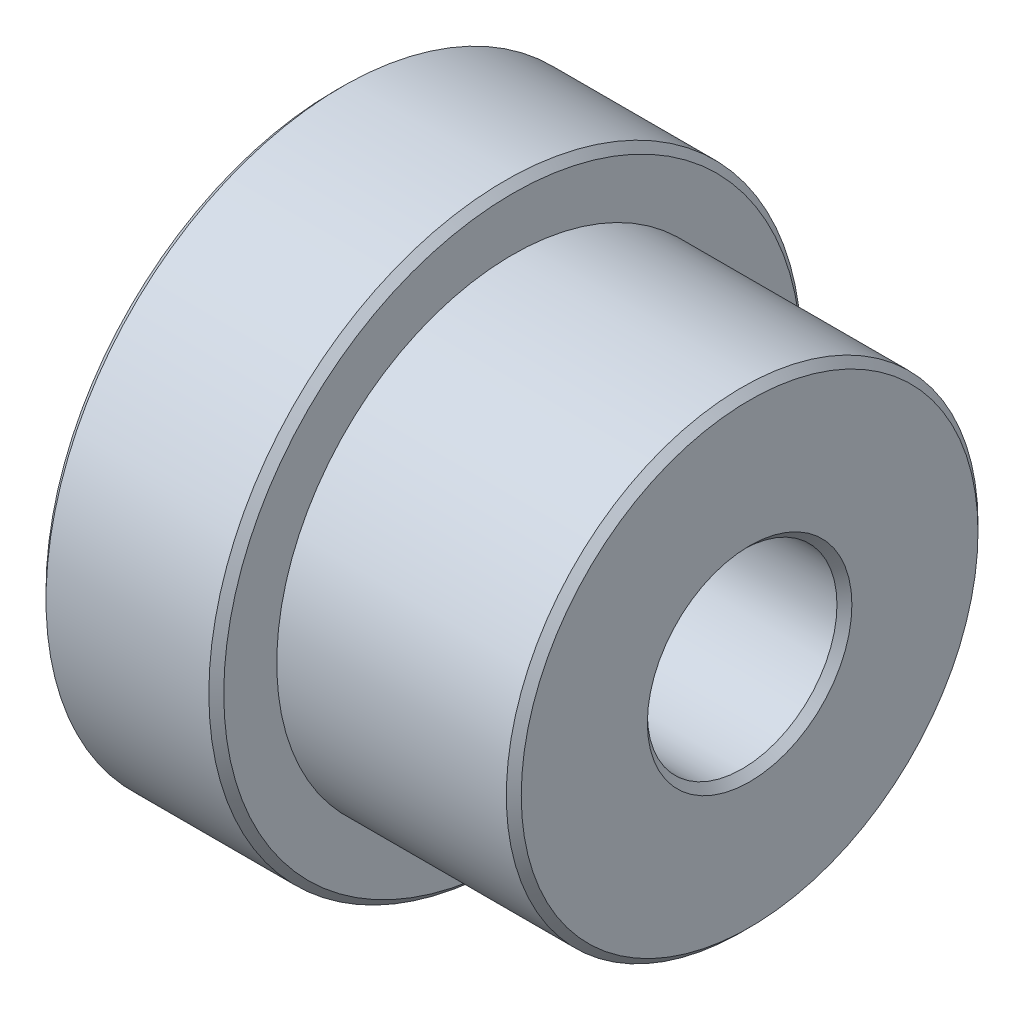
ISO-10303-21;
HEADER;
FILE_DESCRIPTION(('STEP AP214'),'2;1');
FILE_NAME('part.step','',(''),(''),'','','');
FILE_SCHEMA(('AUTOMOTIVE_DESIGN { 1 0 10303 214 1 1 1 1 }'));
ENDSEC;
DATA;
#1=APPLICATION_CONTEXT('core data for automotive mechanical design processes');
#2=APPLICATION_PROTOCOL_DEFINITION('international standard','automotive_design',2000,#1);
#3=PRODUCT_CONTEXT('',#1,'mechanical');
#4=PRODUCT('Part','Part','',(#3));
#5=PRODUCT_RELATED_PRODUCT_CATEGORY('part','',(#4));
#6=PRODUCT_DEFINITION_FORMATION('','',#4);
#7=PRODUCT_DEFINITION_CONTEXT('part definition',#1,'design');
#8=PRODUCT_DEFINITION('design','',#6,#7);
#9=PRODUCT_DEFINITION_SHAPE('','',#8);
#10=(LENGTH_UNIT() NAMED_UNIT(*) SI_UNIT(.MILLI.,.METRE.));
#11=(NAMED_UNIT(*) PLANE_ANGLE_UNIT() SI_UNIT($,.RADIAN.));
#12=(NAMED_UNIT(*) SI_UNIT($,.STERADIAN.) SOLID_ANGLE_UNIT());
#13=UNCERTAINTY_MEASURE_WITH_UNIT(LENGTH_MEASURE(1.E-05),#10,'distance_accuracy_value','');
#14=(GEOMETRIC_REPRESENTATION_CONTEXT(3) GLOBAL_UNCERTAINTY_ASSIGNED_CONTEXT((#13)) GLOBAL_UNIT_ASSIGNED_CONTEXT((#10,
#11,#12)) REPRESENTATION_CONTEXT('',''));
#15=CARTESIAN_POINT('',(0.,0.,0.));
#16=DIRECTION('',(0.,0.,1.));
#17=DIRECTION('',(1.,0.,0.));
#18=AXIS2_PLACEMENT_3D('',#15,#16,#17);
#19=CARTESIAN_POINT('',(12.7,0.,0.));
#20=DIRECTION('',(-1.,0.,0.));
#21=DIRECTION('',(0.,0.,1.));
#22=AXIS2_PLACEMENT_3D('',#19,#20,#21);
#23=CYLINDRICAL_SURFACE('',#22,12.6365);
#24=CARTESIAN_POINT('',(12.3,0.,0.));
#25=DIRECTION('',(1.,0.,0.));
#26=DIRECTION('',(0.,0.,-1.));
#27=AXIS2_PLACEMENT_3D('',#24,#25,#26);
#28=CIRCLE('',#27,12.6365);
#29=CARTESIAN_POINT('',(12.3,0.,-12.6365));
#30=VERTEX_POINT('',#29);
#31=EDGE_CURVE('E46',#30,#30,#28,.F.);
#32=ORIENTED_EDGE('',*,*,#31,.T.);
#33=EDGE_LOOP('',(#32));
#34=FACE_BOUND('',#33,.T.);
#35=CARTESIAN_POINT('',(0.,0.,0.));
#36=DIRECTION('',(1.,0.,0.));
#37=DIRECTION('',(0.,0.,-1.));
#38=AXIS2_PLACEMENT_3D('',#35,#36,#37);
#39=CIRCLE('',#38,12.6365);
#40=CARTESIAN_POINT('',(0.,0.,-12.6365));
#41=VERTEX_POINT('',#40);
#42=EDGE_CURVE('E77',#41,#41,#39,.T.);
#43=ORIENTED_EDGE('',*,*,#42,.T.);
#44=EDGE_LOOP('',(#43));
#45=FACE_BOUND('',#44,.T.);
#46=ADVANCED_FACE('F38',(#34,#45),#23,.T.);
#47=CARTESIAN_POINT('',(12.7,0.,0.));
#48=DIRECTION('',(1.,0.,0.));
#49=DIRECTION('',(0.,0.,-1.));
#50=AXIS2_PLACEMENT_3D('',#47,#48,#49);
#51=PLANE('',#50);
#52=CARTESIAN_POINT('',(12.7,0.,0.));
#53=DIRECTION('',(1.,0.,0.));
#54=DIRECTION('',(0.,0.,-1.));
#55=AXIS2_PLACEMENT_3D('',#52,#53,#54);
#56=CIRCLE('',#55,12.2365);
#57=CARTESIAN_POINT('',(12.7,0.,-12.2365));
#58=VERTEX_POINT('',#57);
#59=EDGE_CURVE('E50',#58,#58,#56,.T.);
#60=ORIENTED_EDGE('',*,*,#59,.T.);
#61=EDGE_LOOP('',(#60));
#62=FACE_BOUND('',#61,.T.);
#63=CARTESIAN_POINT('',(12.7,0.,0.));
#64=DIRECTION('',(1.,0.,0.));
#65=DIRECTION('',(0.,0.,-1.));
#66=AXIS2_PLACEMENT_3D('',#63,#64,#65);
#67=CIRCLE('',#66,5.48000000000001);
#68=CARTESIAN_POINT('',(12.7,0.,-5.48000000000001));
#69=VERTEX_POINT('',#68);
#70=EDGE_CURVE('E54',#69,#69,#67,.F.);
#71=ORIENTED_EDGE('',*,*,#70,.T.);
#72=EDGE_LOOP('',(#71));
#73=FACE_BOUND('',#72,.T.);
#74=ADVANCED_FACE('F126',(#62,#73),#51,.T.);
#75=CARTESIAN_POINT('',(-9.525,0.,0.));
#76=DIRECTION('',(1.,0.,0.));
#77=DIRECTION('',(0.,0.,-1.));
#78=AXIS2_PLACEMENT_3D('',#75,#76,#77);
#79=CYLINDRICAL_SURFACE('',#78,15.875);
#80=CARTESIAN_POINT('',(-0.400000000000005,0.,0.));
#81=DIRECTION('',(-1.,0.,0.));
#82=DIRECTION('',(0.,0.,1.));
#83=AXIS2_PLACEMENT_3D('',#80,#81,#82);
#84=CIRCLE('',#83,15.875);
#85=CARTESIAN_POINT('',(-0.400000000000005,0.,-15.875));
#86=VERTEX_POINT('',#85);
#87=EDGE_CURVE('E62',#86,#86,#84,.T.);
#88=CARTESIAN_POINT('',(-9.12500000000002,0.,0.));
#89=DIRECTION('',(-1.,0.,0.));
#90=DIRECTION('',(0.,0.,1.));
#91=AXIS2_PLACEMENT_3D('',#88,#89,#90);
#92=CIRCLE('',#91,15.875);
#93=CARTESIAN_POINT('',(-9.12500000000002,0.,-15.875));
#94=VERTEX_POINT('',#93);
#95=EDGE_CURVE('E65',#94,#94,#92,.F.);
#96=CARTESIAN_POINT('',(-0.400000000000005,0.,-15.875));
#97=CARTESIAN_POINT('',(-0.490885416666671,0.,-15.875));
#98=CARTESIAN_POINT('',(-0.581770833333339,0.,-15.875));
#99=CARTESIAN_POINT('',(-0.763541666666672,0.,-15.875));
#100=CARTESIAN_POINT('',(-0.854427083333339,0.,-15.875));
#101=CARTESIAN_POINT('',(-1.03619791666667,0.,-15.875));
#102=CARTESIAN_POINT('',(-1.12708333333334,0.,-15.875));
#103=CARTESIAN_POINT('',(-1.30885416666667,0.,-15.875));
#104=CARTESIAN_POINT('',(-1.39973958333334,0.,-15.875));
#105=CARTESIAN_POINT('',(-1.58151041666667,0.,-15.875));
#106=CARTESIAN_POINT('',(-1.67239583333334,0.,-15.875));
#107=CARTESIAN_POINT('',(-1.85416666666667,0.,-15.875));
#108=CARTESIAN_POINT('',(-1.94505208333334,0.,-15.875));
#109=CARTESIAN_POINT('',(-2.12682291666667,0.,-15.875));
#110=CARTESIAN_POINT('',(-2.21770833333334,0.,-15.875));
#111=CARTESIAN_POINT('',(-2.39947916666667,0.,-15.875));
#112=CARTESIAN_POINT('',(-2.49036458333334,0.,-15.875));
#113=CARTESIAN_POINT('',(-2.67213541666667,0.,-15.875));
#114=CARTESIAN_POINT('',(-2.76302083333334,0.,-15.875));
#115=CARTESIAN_POINT('',(-2.94479166666668,0.,-15.875));
#116=CARTESIAN_POINT('',(-3.03567708333334,0.,-15.875));
#117=CARTESIAN_POINT('',(-3.21744791666668,0.,-15.875));
#118=CARTESIAN_POINT('',(-3.30833333333334,0.,-15.875));
#119=CARTESIAN_POINT('',(-3.49010416666668,0.,-15.875));
#120=CARTESIAN_POINT('',(-3.58098958333334,0.,-15.875));
#121=CARTESIAN_POINT('',(-3.76276041666668,0.,-15.875));
#122=CARTESIAN_POINT('',(-3.85364583333334,0.,-15.875));
#123=CARTESIAN_POINT('',(-4.03541666666668,0.,-15.875));
#124=CARTESIAN_POINT('',(-4.12630208333334,0.,-15.875));
#125=CARTESIAN_POINT('',(-4.30807291666668,0.,-15.875));
#126=CARTESIAN_POINT('',(-4.39895833333335,0.,-15.875));
#127=CARTESIAN_POINT('',(-4.58072916666668,0.,-15.875));
#128=CARTESIAN_POINT('',(-4.67161458333335,0.,-15.875));
#129=CARTESIAN_POINT('',(-4.85338541666668,0.,-15.875));
#130=CARTESIAN_POINT('',(-4.94427083333335,0.,-15.875));
#131=CARTESIAN_POINT('',(-5.12604166666668,0.,-15.875));
#132=CARTESIAN_POINT('',(-5.21692708333335,0.,-15.875));
#133=CARTESIAN_POINT('',(-5.39869791666668,0.,-15.875));
#134=CARTESIAN_POINT('',(-5.48958333333335,0.,-15.875));
#135=CARTESIAN_POINT('',(-5.67135416666668,0.,-15.875));
#136=CARTESIAN_POINT('',(-5.76223958333335,0.,-15.875));
#137=CARTESIAN_POINT('',(-5.94401041666668,0.,-15.875));
#138=CARTESIAN_POINT('',(-6.03489583333335,0.,-15.875));
#139=CARTESIAN_POINT('',(-6.21666666666668,0.,-15.875));
#140=CARTESIAN_POINT('',(-6.30755208333335,0.,-15.875));
#141=CARTESIAN_POINT('',(-6.48932291666668,0.,-15.875));
#142=CARTESIAN_POINT('',(-6.58020833333335,0.,-15.875));
#143=CARTESIAN_POINT('',(-6.76197916666668,0.,-15.875));
#144=CARTESIAN_POINT('',(-6.85286458333335,0.,-15.875));
#145=CARTESIAN_POINT('',(-7.03463541666668,0.,-15.875));
#146=CARTESIAN_POINT('',(-7.12552083333335,0.,-15.875));
#147=CARTESIAN_POINT('',(-7.30729166666668,0.,-15.875));
#148=CARTESIAN_POINT('',(-7.39817708333335,0.,-15.875));
#149=CARTESIAN_POINT('',(-7.57994791666668,0.,-15.875));
#150=CARTESIAN_POINT('',(-7.67083333333335,0.,-15.875));
#151=CARTESIAN_POINT('',(-7.85260416666668,0.,-15.875));
#152=CARTESIAN_POINT('',(-7.94348958333335,0.,-15.875));
#153=CARTESIAN_POINT('',(-8.12526041666669,0.,-15.875));
#154=CARTESIAN_POINT('',(-8.21614583333335,0.,-15.875));
#155=CARTESIAN_POINT('',(-8.39791666666668,0.,-15.875));
#156=CARTESIAN_POINT('',(-8.48880208333335,0.,-15.875));
#157=CARTESIAN_POINT('',(-8.67057291666669,0.,-15.875));
#158=CARTESIAN_POINT('',(-8.76145833333335,0.,-15.875));
#159=CARTESIAN_POINT('',(-8.94322916666669,0.,-15.875));
#160=CARTESIAN_POINT('',(-9.03411458333335,0.,-15.875));
#161=CARTESIAN_POINT('',(-9.12500000000002,0.,-15.875));
#162=B_SPLINE_CURVE_WITH_KNOTS('',3,(#96,#97,#98,#99,#100,#101,#102,#103,#104,#105,#106,#107,
#108,#109,#110,#111,#112,#113,#114,#115,#116,#117,#118,#119,#120,#121,#122,#123,#124,#125,#126,
#127,#128,#129,#130,#131,#132,#133,#134,#135,#136,#137,#138,#139,#140,#141,#142,#143,#144,#145,
#146,#147,#148,#149,#150,#151,#152,#153,#154,#155,#156,#157,#158,#159,#160,#161),.UNSPECIFIED.,
.F.,.F.,(4,2,2,2,2,2,2,2,2,2,2,2,2,2,2,2,2,2,2,2,2,2,2,2,2,2,2,2,2,2,2,2,4),(0.,
0.272656250000001,0.545312500000001,0.817968750000002,1.090625,1.36328125,1.6359375,1.90859375,
2.18125,2.45390625,2.7265625,2.99921875000001,3.27187500000001,3.54453125000001,
3.81718750000001,4.08984375000001,4.36250000000001,4.63515625000001,4.90781250000001,
5.18046875000001,5.45312500000001,5.72578125000001,5.99843750000001,6.27109375000001,
6.54375000000001,6.81640625000001,7.08906250000001,7.36171875000001,7.63437500000001,
7.90703125000001,8.17968750000001,8.45234375000001,8.72500000000002),.UNSPECIFIED.);
#163=EDGE_CURVE('BSEAM131',#86,#94,#162,.T.);
#164=ORIENTED_EDGE('',*,*,#87,.T.);
#165=ORIENTED_EDGE('',*,*,#95,.T.);
#166=ORIENTED_EDGE('',*,*,#163,.T.);
#167=ORIENTED_EDGE('',*,*,#163,.F.);
#168=EDGE_LOOP('',(#164,#166,#165,#167));
#169=FACE_BOUND('',#168,.T.);
#170=ADVANCED_FACE('F131',(#169),#79,.T.);
#171=CARTESIAN_POINT('',(-9.525,0.,0.));
#172=DIRECTION('',(-1.,0.,0.));
#173=DIRECTION('',(0.,0.,1.));
#174=AXIS2_PLACEMENT_3D('',#171,#172,#173);
#175=PLANE('',#174);
#176=CARTESIAN_POINT('',(-9.525,0.,0.));
#177=DIRECTION('',(-1.,0.,0.));
#178=DIRECTION('',(0.,0.,1.));
#179=AXIS2_PLACEMENT_3D('',#176,#177,#178);
#180=CIRCLE('',#179,11.5125);
#181=CARTESIAN_POINT('',(-9.525,0.,11.5125));
#182=VERTEX_POINT('',#181);
#183=EDGE_CURVE('E68',#182,#182,#180,.F.);
#184=ORIENTED_EDGE('',*,*,#183,.T.);
#185=EDGE_LOOP('',(#184));
#186=FACE_BOUND('',#185,.T.);
#187=CARTESIAN_POINT('',(-9.525,0.,0.));
#188=DIRECTION('',(-1.,0.,0.));
#189=DIRECTION('',(0.,0.,1.));
#190=AXIS2_PLACEMENT_3D('',#187,#188,#189);
#191=CIRCLE('',#190,15.475);
#192=CARTESIAN_POINT('',(-9.525,0.,15.475));
#193=VERTEX_POINT('',#192);
#194=EDGE_CURVE('E71',#193,#193,#191,.T.);
#195=ORIENTED_EDGE('',*,*,#194,.T.);
#196=EDGE_LOOP('',(#195));
#197=FACE_BOUND('',#196,.T.);
#198=ADVANCED_FACE('F121',(#186,#197),#175,.T.);
#199=CARTESIAN_POINT('',(0.,0.,0.));
#200=DIRECTION('',(-1.,0.,0.));
#201=DIRECTION('',(0.,0.,1.));
#202=AXIS2_PLACEMENT_3D('',#199,#200,#201);
#203=PLANE('',#202);
#204=CARTESIAN_POINT('',(0.,0.,0.));
#205=DIRECTION('',(-1.,0.,0.));
#206=DIRECTION('',(0.,0.,1.));
#207=AXIS2_PLACEMENT_3D('',#204,#205,#206);
#208=CIRCLE('',#207,15.475);
#209=CARTESIAN_POINT('',(0.,0.,15.475));
#210=VERTEX_POINT('',#209);
#211=EDGE_CURVE('E59',#210,#210,#208,.F.);
#212=ORIENTED_EDGE('',*,*,#211,.T.);
#213=EDGE_LOOP('',(#212));
#214=FACE_BOUND('',#213,.T.);
#215=ORIENTED_EDGE('',*,*,#42,.F.);
#216=EDGE_LOOP('',(#215));
#217=FACE_BOUND('',#216,.T.);
#218=ADVANCED_FACE('F115',(#214,#217),#203,.F.);
#219=CARTESIAN_POINT('',(-2.413,0.,0.));
#220=DIRECTION('',(-1.,0.,0.));
#221=DIRECTION('',(0.,0.,1.));
#222=AXIS2_PLACEMENT_3D('',#219,#220,#221);
#223=CYLINDRICAL_SURFACE('',#222,11.1125);
#224=CARTESIAN_POINT('',(-9.12500000000001,0.,0.));
#225=DIRECTION('',(-1.,0.,0.));
#226=DIRECTION('',(0.,0.,1.));
#227=AXIS2_PLACEMENT_3D('',#224,#225,#226);
#228=CIRCLE('',#227,11.1125);
#229=CARTESIAN_POINT('',(-9.12500000000001,0.,11.1125));
#230=VERTEX_POINT('',#229);
#231=EDGE_CURVE('E74',#230,#230,#228,.T.);
#232=ORIENTED_EDGE('',*,*,#231,.T.);
#233=EDGE_LOOP('',(#232));
#234=FACE_BOUND('',#233,.T.);
#235=CARTESIAN_POINT('',(-2.413,0.,0.));
#236=DIRECTION('',(-1.,0.,0.));
#237=DIRECTION('',(0.,0.,1.));
#238=AXIS2_PLACEMENT_3D('',#235,#236,#237);
#239=CIRCLE('',#238,11.1125);
#240=CARTESIAN_POINT('',(-2.413,0.,11.1125));
#241=VERTEX_POINT('',#240);
#242=EDGE_CURVE('E80',#241,#241,#239,.T.);
#243=ORIENTED_EDGE('',*,*,#242,.F.);
#244=EDGE_LOOP('',(#243));
#245=FACE_BOUND('',#244,.T.);
#246=ADVANCED_FACE('F110',(#234,#245),#223,.F.);
#247=CARTESIAN_POINT('',(-2.413,0.,0.));
#248=DIRECTION('',(-1.,0.,0.));
#249=DIRECTION('',(0.,0.,1.));
#250=AXIS2_PLACEMENT_3D('',#247,#248,#249);
#251=PLANE('',#250);
#252=CARTESIAN_POINT('',(-2.413,0.,0.));
#253=DIRECTION('',(-1.,0.,0.));
#254=DIRECTION('',(0.,0.,1.));
#255=AXIS2_PLACEMENT_3D('',#252,#253,#254);
#256=CIRCLE('',#255,7.27458794);
#257=CARTESIAN_POINT('',(-2.413,0.,7.27458794));
#258=VERTEX_POINT('',#257);
#259=EDGE_CURVE('E84',#258,#258,#256,.T.);
#260=ORIENTED_EDGE('',*,*,#259,.F.);
#261=EDGE_LOOP('',(#260));
#262=FACE_BOUND('',#261,.T.);
#263=ORIENTED_EDGE('',*,*,#242,.T.);
#264=EDGE_LOOP('',(#263));
#265=FACE_BOUND('',#264,.T.);
#266=ADVANCED_FACE('F104',(#262,#265),#251,.T.);
#267=CARTESIAN_POINT('',(-2.213,0.,0.));
#268=DIRECTION('',(-1.,0.,0.));
#269=DIRECTION('',(0.,0.,1.));
#270=AXIS2_PLACEMENT_3D('',#267,#268,#269);
#271=CYLINDRICAL_SURFACE('',#270,7.27458794);
#272=CARTESIAN_POINT('',(-2.213,0.,0.));
#273=DIRECTION('',(-1.,0.,0.));
#274=DIRECTION('',(0.,0.,1.));
#275=AXIS2_PLACEMENT_3D('',#272,#273,#274);
#276=CIRCLE('',#275,7.27458794);
#277=CARTESIAN_POINT('',(-2.213,0.,7.27458794));
#278=VERTEX_POINT('',#277);
#279=EDGE_CURVE('E83',#278,#278,#276,.T.);
#280=ORIENTED_EDGE('',*,*,#279,.F.);
#281=EDGE_LOOP('',(#280));
#282=FACE_BOUND('',#281,.T.);
#283=ORIENTED_EDGE('',*,*,#259,.T.);
#284=EDGE_LOOP('',(#283));
#285=FACE_BOUND('',#284,.T.);
#286=ADVANCED_FACE('F98',(#282,#285),#271,.F.);
#287=CARTESIAN_POINT('',(-2.213,0.,0.));
#288=DIRECTION('',(-1.,0.,0.));
#289=DIRECTION('',(0.,0.,1.));
#290=AXIS2_PLACEMENT_3D('',#287,#288,#289);
#291=PLANE('',#290);
#292=CARTESIAN_POINT('',(-2.213,0.,0.));
#293=DIRECTION('',(-1.,0.,0.));
#294=DIRECTION('',(0.,0.,1.));
#295=AXIS2_PLACEMENT_3D('',#292,#293,#294);
#296=CIRCLE('',#295,5.08);
#297=CARTESIAN_POINT('',(-2.213,0.,5.08));
#298=VERTEX_POINT('',#297);
#299=EDGE_CURVE('E87',#298,#298,#296,.T.);
#300=ORIENTED_EDGE('',*,*,#299,.F.);
#301=EDGE_LOOP('',(#300));
#302=FACE_BOUND('',#301,.T.);
#303=ORIENTED_EDGE('',*,*,#279,.T.);
#304=EDGE_LOOP('',(#303));
#305=FACE_BOUND('',#304,.T.);
#306=ADVANCED_FACE('F95',(#302,#305),#291,.T.);
#307=CARTESIAN_POINT('',(12.7,0.,0.));
#308=DIRECTION('',(-1.,0.,0.));
#309=DIRECTION('',(0.,0.,1.));
#310=AXIS2_PLACEMENT_3D('',#307,#308,#309);
#311=CYLINDRICAL_SURFACE('',#310,5.08);
#312=CARTESIAN_POINT('',(12.3,0.,0.));
#313=DIRECTION('',(1.,0.,0.));
#314=DIRECTION('',(0.,0.,-1.));
#315=AXIS2_PLACEMENT_3D('',#312,#313,#314);
#316=CIRCLE('',#315,5.08);
#317=CARTESIAN_POINT('',(12.3,0.,-5.08));
#318=VERTEX_POINT('',#317);
#319=EDGE_CURVE('E10',#318,#318,#316,.T.);
#320=ORIENTED_EDGE('',*,*,#319,.T.);
#321=EDGE_LOOP('',(#320));
#322=FACE_BOUND('',#321,.T.);
#323=ORIENTED_EDGE('',*,*,#299,.T.);
#324=EDGE_LOOP('',(#323));
#325=FACE_BOUND('',#324,.T.);
#326=ADVANCED_FACE('F93',(#322,#325),#311,.F.);
#327=CARTESIAN_POINT('',(-9.12500000000001,0.,0.));
#328=DIRECTION('',(-1.,0.,0.));
#329=DIRECTION('',(0.,0.,1.));
#330=AXIS2_PLACEMENT_3D('',#327,#328,#329);
#331=CONICAL_SURFACE('',#330,11.1125,0.785398163397453);
#332=ORIENTED_EDGE('',*,*,#183,.F.);
#333=EDGE_LOOP('',(#332));
#334=FACE_BOUND('',#333,.T.);
#335=ORIENTED_EDGE('',*,*,#231,.F.);
#336=EDGE_LOOP('',(#335));
#337=FACE_BOUND('',#336,.T.);
#338=ADVANCED_FACE('F138',(#334,#337),#331,.F.);
#339=CARTESIAN_POINT('',(-0.400000000000005,0.,0.));
#340=DIRECTION('',(-1.,0.,0.));
#341=DIRECTION('',(0.,0.,1.));
#342=AXIS2_PLACEMENT_3D('',#339,#340,#341);
#343=CONICAL_SURFACE('',#342,15.875,0.785398163397444);
#344=ORIENTED_EDGE('',*,*,#211,.F.);
#345=EDGE_LOOP('',(#344));
#346=FACE_BOUND('',#345,.T.);
#347=ORIENTED_EDGE('',*,*,#87,.F.);
#348=EDGE_LOOP('',(#347));
#349=FACE_BOUND('',#348,.T.);
#350=ADVANCED_FACE('F144',(#346,#349),#343,.T.);
#351=CARTESIAN_POINT('',(-9.525,0.,0.));
#352=DIRECTION('',(1.,0.,0.));
#353=DIRECTION('',(0.,0.,-1.));
#354=AXIS2_PLACEMENT_3D('',#351,#352,#353);
#355=CONICAL_SURFACE('',#354,15.475,0.785398163397444);
#356=ORIENTED_EDGE('',*,*,#95,.F.);
#357=EDGE_LOOP('',(#356));
#358=FACE_BOUND('',#357,.T.);
#359=ORIENTED_EDGE('',*,*,#194,.F.);
#360=EDGE_LOOP('',(#359));
#361=FACE_BOUND('',#360,.T.);
#362=ADVANCED_FACE('F151',(#358,#361),#355,.T.);
#363=CARTESIAN_POINT('',(12.7,0.,0.));
#364=DIRECTION('',(-1.,0.,0.));
#365=DIRECTION('',(0.,0.,1.));
#366=AXIS2_PLACEMENT_3D('',#363,#364,#365);
#367=CONICAL_SURFACE('',#366,12.2365,0.78539816339745);
#368=ORIENTED_EDGE('',*,*,#31,.F.);
#369=EDGE_LOOP('',(#368));
#370=FACE_BOUND('',#369,.T.);
#371=ORIENTED_EDGE('',*,*,#59,.F.);
#372=EDGE_LOOP('',(#371));
#373=FACE_BOUND('',#372,.T.);
#374=ADVANCED_FACE('F157',(#370,#373),#367,.T.);
#375=CARTESIAN_POINT('',(12.7,0.,0.));
#376=DIRECTION('',(1.,0.,0.));
#377=DIRECTION('',(0.,0.,-1.));
#378=AXIS2_PLACEMENT_3D('',#375,#376,#377);
#379=CONICAL_SURFACE('',#378,5.48000000000001,0.785398163397451);
#380=ORIENTED_EDGE('',*,*,#319,.F.);
#381=EDGE_LOOP('',(#380));
#382=FACE_BOUND('',#381,.T.);
#383=ORIENTED_EDGE('',*,*,#70,.F.);
#384=EDGE_LOOP('',(#383));
#385=FACE_BOUND('',#384,.T.);
#386=ADVANCED_FACE('F41',(#382,#385),#379,.F.);
#387=CLOSED_SHELL('',(#46,#74,#170,#198,#218,#246,#266,#286,#306,#326,#338,#350,#362,#374,#386));
#388=MANIFOLD_SOLID_BREP('B2',#387);
#389=ADVANCED_BREP_SHAPE_REPRESENTATION('',(#18,#388),#14);
#390=SHAPE_DEFINITION_REPRESENTATION(#9,#389);
ENDSEC;
END-ISO-10303-21;
